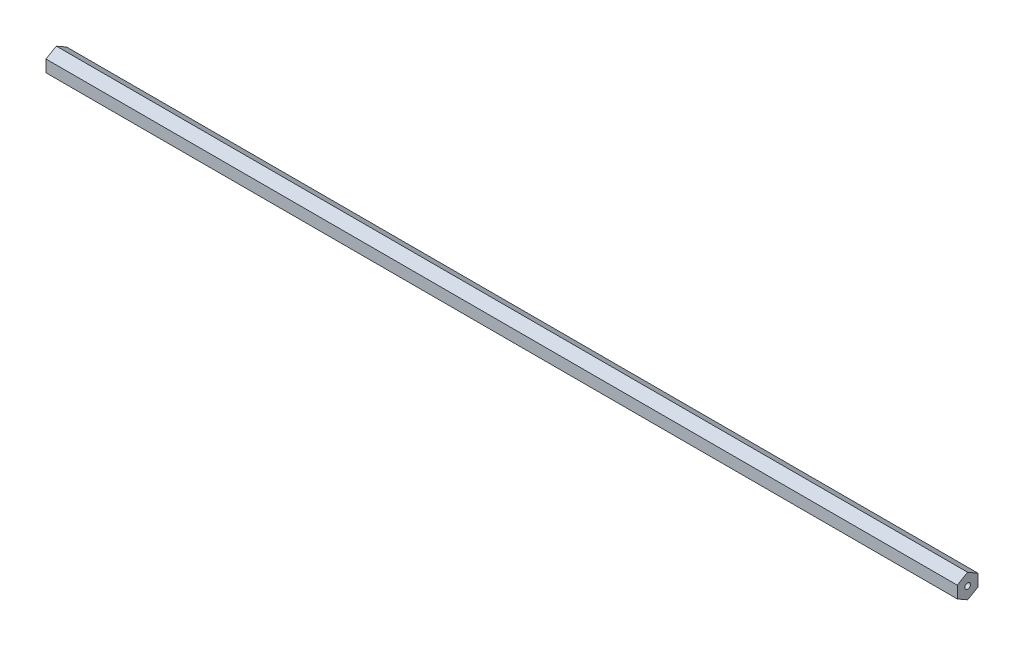
ISO-10303-21;
HEADER;
FILE_DESCRIPTION(('STEP AP214'),'2;1');
FILE_NAME('part.step','',(''),(''),'','','');
FILE_SCHEMA(('AUTOMOTIVE_DESIGN { 1 0 10303 214 1 1 1 1 }'));
ENDSEC;
DATA;
#1=APPLICATION_CONTEXT('core data for automotive mechanical design processes');
#2=APPLICATION_PROTOCOL_DEFINITION('international standard','automotive_design',2000,#1);
#3=PRODUCT_CONTEXT('',#1,'mechanical');
#4=PRODUCT('Part','Part','',(#3));
#5=PRODUCT_RELATED_PRODUCT_CATEGORY('part','',(#4));
#6=PRODUCT_DEFINITION_FORMATION('','',#4);
#7=PRODUCT_DEFINITION_CONTEXT('part definition',#1,'design');
#8=PRODUCT_DEFINITION('design','',#6,#7);
#9=PRODUCT_DEFINITION_SHAPE('','',#8);
#10=(LENGTH_UNIT() NAMED_UNIT(*) SI_UNIT(.MILLI.,.METRE.));
#11=(NAMED_UNIT(*) PLANE_ANGLE_UNIT() SI_UNIT($,.RADIAN.));
#12=(NAMED_UNIT(*) SI_UNIT($,.STERADIAN.) SOLID_ANGLE_UNIT());
#13=UNCERTAINTY_MEASURE_WITH_UNIT(LENGTH_MEASURE(1.E-05),#10,'distance_accuracy_value','');
#14=(GEOMETRIC_REPRESENTATION_CONTEXT(3) GLOBAL_UNCERTAINTY_ASSIGNED_CONTEXT((#13)) GLOBAL_UNIT_ASSIGNED_CONTEXT((#10,
#11,#12)) REPRESENTATION_CONTEXT('',''));
#15=CARTESIAN_POINT('',(0.,0.,0.));
#16=DIRECTION('',(0.,0.,1.));
#17=DIRECTION('',(1.,0.,0.));
#18=AXIS2_PLACEMENT_3D('',#15,#16,#17);
#19=CARTESIAN_POINT('',(266.699999999844,0.,0.));
#20=DIRECTION('',(1.,0.,0.));
#21=DIRECTION('',(0.,0.,-1.));
#22=AXIS2_PLACEMENT_3D('',#19,#20,#21);
#23=CONICAL_SURFACE('',#22,1.72719999983428,1.02974425849035);
#24=CARTESIAN_POINT('',(265.662193538645,-2.27373675443232E-10,0.));
#25=VERTEX_POINT('',#24);
#26=VERTEX_LOOP('',#25);
#27=FACE_BOUND('',#26,.T.);
#28=CARTESIAN_POINT('',(266.7,0.,0.));
#29=DIRECTION('',(1.,0.,0.));
#30=DIRECTION('',(0.,0.,-1.));
#31=AXIS2_PLACEMENT_3D('',#28,#29,#30);
#32=CIRCLE('',#31,1.7272);
#33=CARTESIAN_POINT('',(266.7,0.,-1.7272));
#34=VERTEX_POINT('',#33);
#35=EDGE_CURVE('E78',#34,#34,#32,.T.);
#36=ORIENTED_EDGE('',*,*,#35,.T.);
#37=EDGE_LOOP('',(#36));
#38=FACE_BOUND('',#37,.T.);
#39=ADVANCED_FACE('F16',(#27,#38),#23,.F.);
#40=CARTESIAN_POINT('',(-266.699999999844,0.,0.));
#41=DIRECTION('',(-1.,0.,0.));
#42=DIRECTION('',(0.,0.,1.));
#43=AXIS2_PLACEMENT_3D('',#40,#41,#42);
#44=CONICAL_SURFACE('',#43,1.72719999983428,1.02974425849035);
#45=CARTESIAN_POINT('',(-265.662193538645,-2.27373675443232E-10,0.));
#46=VERTEX_POINT('',#45);
#47=VERTEX_LOOP('',#46);
#48=FACE_BOUND('',#47,.T.);
#49=CARTESIAN_POINT('',(-266.7,0.,0.));
#50=DIRECTION('',(1.,0.,0.));
#51=DIRECTION('',(0.,0.,-1.));
#52=AXIS2_PLACEMENT_3D('',#49,#50,#51);
#53=CIRCLE('',#52,1.7272);
#54=CARTESIAN_POINT('',(-266.7,0.,-1.7272));
#55=VERTEX_POINT('',#54);
#56=EDGE_CURVE('E86',#55,#55,#53,.F.);
#57=ORIENTED_EDGE('',*,*,#56,.T.);
#58=EDGE_LOOP('',(#57));
#59=FACE_BOUND('',#58,.T.);
#60=ADVANCED_FACE('F75',(#48,#59),#44,.F.);
#61=CARTESIAN_POINT('',(264.97530321572,0.,0.));
#62=DIRECTION('',(1.,0.,0.));
#63=DIRECTION('',(0.,0.,-1.));
#64=AXIS2_PLACEMENT_3D('',#61,#62,#63);
#65=CYLINDRICAL_SURFACE('',#64,1.7272);
#66=ORIENTED_EDGE('',*,*,#35,.F.);
#67=EDGE_LOOP('',(#66));
#68=FACE_BOUND('',#67,.T.);
#69=CARTESIAN_POINT('',(279.4,0.,0.));
#70=DIRECTION('',(1.,0.,0.));
#71=DIRECTION('',(0.,0.,-1.));
#72=AXIS2_PLACEMENT_3D('',#69,#70,#71);
#73=CIRCLE('',#72,1.7272);
#74=CARTESIAN_POINT('',(279.4,0.,-1.7272));
#75=VERTEX_POINT('',#74);
#76=EDGE_CURVE('E19',#75,#75,#73,.F.);
#77=ORIENTED_EDGE('',*,*,#76,.F.);
#78=EDGE_LOOP('',(#77));
#79=FACE_BOUND('',#78,.T.);
#80=ADVANCED_FACE('F188',(#68,#79),#65,.F.);
#81=CARTESIAN_POINT('',(-279.4,-3.66617420935396,6.35));
#82=DIRECTION('',(0.,-0.866025403784429,0.500000000000017));
#83=DIRECTION('',(0.,-0.500000000000017,-0.866025403784429));
#84=AXIS2_PLACEMENT_3D('',#81,#82,#83);
#85=PLANE('',#84);
#86=DIRECTION('',(1.,0.,0.));
#87=VECTOR('',#86,1.);
#88=CARTESIAN_POINT('',(-279.4,-3.66617420935396,6.35));
#89=LINE('',#88,#87);
#90=CARTESIAN_POINT('',(-279.4,-3.66617420935396,6.35));
#91=VERTEX_POINT('',#90);
#92=CARTESIAN_POINT('',(279.4,-3.66617420935396,6.35));
#93=VERTEX_POINT('',#92);
#94=EDGE_CURVE('E123',#91,#93,#89,.T.);
#95=ORIENTED_EDGE('',*,*,#94,.F.);
#96=DIRECTION('',(0.,-0.499999999999983,-0.866025403784448));
#97=VECTOR('',#96,1.);
#98=CARTESIAN_POINT('',(-279.4,-3.66617420935396,6.35));
#99=LINE('',#98,#97);
#100=CARTESIAN_POINT('',(-279.4,-7.33234841870804,0.));
#101=VERTEX_POINT('',#100);
#102=EDGE_CURVE('E102',#91,#101,#99,.T.);
#103=ORIENTED_EDGE('',*,*,#102,.T.);
#104=DIRECTION('',(1.,0.,0.));
#105=VECTOR('',#104,1.);
#106=CARTESIAN_POINT('',(-279.4,-7.33234841870792,0.));
#107=LINE('',#106,#105);
#108=CARTESIAN_POINT('',(279.4,-7.33234841870804,0.));
#109=VERTEX_POINT('',#108);
#110=EDGE_CURVE('E80',#109,#101,#107,.F.);
#111=ORIENTED_EDGE('',*,*,#110,.F.);
#112=DIRECTION('',(0.,-0.499999999999983,-0.866025403784448));
#113=VECTOR('',#112,1.);
#114=CARTESIAN_POINT('',(279.4,-3.66617420935396,6.35));
#115=LINE('',#114,#113);
#116=EDGE_CURVE('E120',#93,#109,#115,.T.);
#117=ORIENTED_EDGE('',*,*,#116,.F.);
#118=EDGE_LOOP('',(#95,#103,#111,#117));
#119=FACE_BOUND('',#118,.T.);
#120=ADVANCED_FACE('F178',(#119),#85,.T.);
#121=CARTESIAN_POINT('',(-279.4,-7.33234841870792,0.));
#122=DIRECTION('',(0.,-0.866025403784429,-0.500000000000017));
#123=DIRECTION('',(0.,0.500000000000017,-0.866025403784429));
#124=AXIS2_PLACEMENT_3D('',#121,#122,#123);
#125=PLANE('',#124);
#126=ORIENTED_EDGE('',*,*,#110,.T.);
#127=DIRECTION('',(0.,0.499999999999983,-0.866025403784448));
#128=VECTOR('',#127,1.);
#129=CARTESIAN_POINT('',(-279.4,-7.33234841870792,0.));
#130=LINE('',#129,#128);
#131=CARTESIAN_POINT('',(-279.4,-3.66617420935384,-6.34999999999993));
#132=VERTEX_POINT('',#131);
#133=EDGE_CURVE('E97',#101,#132,#130,.T.);
#134=ORIENTED_EDGE('',*,*,#133,.T.);
#135=DIRECTION('',(-1.,0.,0.));
#136=VECTOR('',#135,1.);
#137=CARTESIAN_POINT('',(-279.4,-3.66617420935396,-6.35));
#138=LINE('',#137,#136);
#139=CARTESIAN_POINT('',(279.4,-3.66617420935384,-6.34999999999993));
#140=VERTEX_POINT('',#139);
#141=EDGE_CURVE('E83',#140,#132,#138,.T.);
#142=ORIENTED_EDGE('',*,*,#141,.F.);
#143=DIRECTION('',(0.,0.499999999999983,-0.866025403784448));
#144=VECTOR('',#143,1.);
#145=CARTESIAN_POINT('',(279.4,-7.33234841870792,0.));
#146=LINE('',#145,#144);
#147=EDGE_CURVE('E117',#109,#140,#146,.T.);
#148=ORIENTED_EDGE('',*,*,#147,.F.);
#149=EDGE_LOOP('',(#126,#134,#142,#148));
#150=FACE_BOUND('',#149,.T.);
#151=ADVANCED_FACE('F147',(#150),#125,.T.);
#152=CARTESIAN_POINT('',(-279.4,-3.66617420935396,-6.35));
#153=DIRECTION('',(0.,0.,-1.));
#154=DIRECTION('',(-1.,0.,0.));
#155=AXIS2_PLACEMENT_3D('',#152,#153,#154);
#156=PLANE('',#155);
#157=ORIENTED_EDGE('',*,*,#141,.T.);
#158=DIRECTION('',(0.,1.,0.));
#159=VECTOR('',#158,1.);
#160=CARTESIAN_POINT('',(-279.4,0.,-6.35));
#161=LINE('',#160,#159);
#162=CARTESIAN_POINT('',(-279.4,3.66617420935396,-6.35));
#163=VERTEX_POINT('',#162);
#164=EDGE_CURVE('E95',#132,#163,#161,.T.);
#165=ORIENTED_EDGE('',*,*,#164,.T.);
#166=DIRECTION('',(1.,0.,0.));
#167=VECTOR('',#166,1.);
#168=CARTESIAN_POINT('',(-279.4,3.66617420935396,-6.35));
#169=LINE('',#168,#167);
#170=CARTESIAN_POINT('',(279.4,3.66617420935396,-6.35));
#171=VERTEX_POINT('',#170);
#172=EDGE_CURVE('E107',#171,#163,#169,.F.);
#173=ORIENTED_EDGE('',*,*,#172,.F.);
#174=DIRECTION('',(0.,1.,0.));
#175=VECTOR('',#174,1.);
#176=CARTESIAN_POINT('',(279.4,0.,-6.35));
#177=LINE('',#176,#175);
#178=EDGE_CURVE('E115',#140,#171,#177,.T.);
#179=ORIENTED_EDGE('',*,*,#178,.F.);
#180=EDGE_LOOP('',(#157,#165,#173,#179));
#181=FACE_BOUND('',#180,.T.);
#182=ADVANCED_FACE('F137',(#181),#156,.T.);
#183=CARTESIAN_POINT('',(-264.97530321572,0.,0.));
#184=DIRECTION('',(1.,0.,0.));
#185=DIRECTION('',(0.,0.,-1.));
#186=AXIS2_PLACEMENT_3D('',#183,#184,#185);
#187=CYLINDRICAL_SURFACE('',#186,1.7272);
#188=ORIENTED_EDGE('',*,*,#56,.F.);
#189=EDGE_LOOP('',(#188));
#190=FACE_BOUND('',#189,.T.);
#191=CARTESIAN_POINT('',(-279.4,0.,0.));
#192=DIRECTION('',(1.,0.,0.));
#193=DIRECTION('',(0.,0.,-1.));
#194=AXIS2_PLACEMENT_3D('',#191,#192,#193);
#195=CIRCLE('',#194,1.7272);
#196=CARTESIAN_POINT('',(-279.4,0.,-1.7272));
#197=VERTEX_POINT('',#196);
#198=EDGE_CURVE('E87',#197,#197,#195,.F.);
#199=ORIENTED_EDGE('',*,*,#198,.T.);
#200=EDGE_LOOP('',(#199));
#201=FACE_BOUND('',#200,.T.);
#202=ADVANCED_FACE('F134',(#190,#201),#187,.F.);
#203=CARTESIAN_POINT('',(-279.4,3.66617420935396,6.35));
#204=DIRECTION('',(0.,0.,1.));
#205=DIRECTION('',(1.,0.,0.));
#206=AXIS2_PLACEMENT_3D('',#203,#204,#205);
#207=PLANE('',#206);
#208=DIRECTION('',(1.,0.,0.));
#209=VECTOR('',#208,1.);
#210=CARTESIAN_POINT('',(-279.4,3.66617420935371,6.34999999999986));
#211=LINE('',#210,#209);
#212=CARTESIAN_POINT('',(-279.4,3.6661742093539,6.34999999999997));
#213=VERTEX_POINT('',#212);
#214=CARTESIAN_POINT('',(279.4,3.6661742093539,6.34999999999997));
#215=VERTEX_POINT('',#214);
#216=EDGE_CURVE('E89',#213,#215,#211,.T.);
#217=ORIENTED_EDGE('',*,*,#216,.F.);
#218=DIRECTION('',(0.,1.,0.));
#219=VECTOR('',#218,1.);
#220=CARTESIAN_POINT('',(-279.4,0.,6.35));
#221=LINE('',#220,#219);
#222=EDGE_CURVE('E104',#213,#91,#221,.F.);
#223=ORIENTED_EDGE('',*,*,#222,.T.);
#224=ORIENTED_EDGE('',*,*,#94,.T.);
#225=DIRECTION('',(0.,1.,0.));
#226=VECTOR('',#225,1.);
#227=CARTESIAN_POINT('',(279.4,0.,6.35));
#228=LINE('',#227,#226);
#229=EDGE_CURVE('E112',#215,#93,#228,.F.);
#230=ORIENTED_EDGE('',*,*,#229,.F.);
#231=EDGE_LOOP('',(#217,#223,#224,#230));
#232=FACE_BOUND('',#231,.T.);
#233=ADVANCED_FACE('F136',(#232),#207,.T.);
#234=CARTESIAN_POINT('',(279.4,0.,0.));
#235=DIRECTION('',(1.,0.,0.));
#236=DIRECTION('',(0.,0.,-1.));
#237=AXIS2_PLACEMENT_3D('',#234,#235,#236);
#238=PLANE('',#237);
#239=ORIENTED_EDGE('',*,*,#76,.T.);
#240=EDGE_LOOP('',(#239));
#241=FACE_BOUND('',#240,.T.);
#242=DIRECTION('',(0.,-0.500000000000017,0.866025403784429));
#243=VECTOR('',#242,1.);
#244=CARTESIAN_POINT('',(279.4,7.33234841870792,0.));
#245=LINE('',#244,#243);
#246=CARTESIAN_POINT('',(279.4,7.33234841870798,0.));
#247=VERTEX_POINT('',#246);
#248=EDGE_CURVE('E93',#215,#247,#245,.F.);
#249=ORIENTED_EDGE('',*,*,#248,.F.);
#250=ORIENTED_EDGE('',*,*,#229,.T.);
#251=ORIENTED_EDGE('',*,*,#116,.T.);
#252=ORIENTED_EDGE('',*,*,#147,.T.);
#253=ORIENTED_EDGE('',*,*,#178,.T.);
#254=DIRECTION('',(0.,0.500000000000017,0.866025403784429));
#255=VECTOR('',#254,1.);
#256=CARTESIAN_POINT('',(279.4,3.66617420935396,-6.35));
#257=LINE('',#256,#255);
#258=EDGE_CURVE('E109',#247,#171,#257,.F.);
#259=ORIENTED_EDGE('',*,*,#258,.F.);
#260=EDGE_LOOP('',(#249,#250,#251,#252,#253,#259));
#261=FACE_BOUND('',#260,.T.);
#262=ADVANCED_FACE('F144',(#241,#261),#238,.T.);
#263=CARTESIAN_POINT('',(-279.4,3.66617420935396,-6.35));
#264=DIRECTION('',(0.,0.866025403784429,-0.500000000000017));
#265=DIRECTION('',(0.,0.500000000000017,0.866025403784429));
#266=AXIS2_PLACEMENT_3D('',#263,#264,#265);
#267=PLANE('',#266);
#268=ORIENTED_EDGE('',*,*,#172,.T.);
#269=DIRECTION('',(0.,0.499999999999983,0.866025403784448));
#270=VECTOR('',#269,1.);
#271=CARTESIAN_POINT('',(-279.4,3.66617420935396,-6.35));
#272=LINE('',#271,#270);
#273=CARTESIAN_POINT('',(-279.4,7.33234841870804,0.));
#274=VERTEX_POINT('',#273);
#275=EDGE_CURVE('E34',#163,#274,#272,.T.);
#276=ORIENTED_EDGE('',*,*,#275,.T.);
#277=DIRECTION('',(1.,0.,0.));
#278=VECTOR('',#277,1.);
#279=CARTESIAN_POINT('',(-279.4,7.33234841870792,0.));
#280=LINE('',#279,#278);
#281=EDGE_CURVE('E25',#247,#274,#280,.F.);
#282=ORIENTED_EDGE('',*,*,#281,.F.);
#283=ORIENTED_EDGE('',*,*,#258,.T.);
#284=EDGE_LOOP('',(#268,#276,#282,#283));
#285=FACE_BOUND('',#284,.T.);
#286=ADVANCED_FACE('F157',(#285),#267,.T.);
#287=CARTESIAN_POINT('',(-279.4,0.,0.));
#288=DIRECTION('',(1.,0.,0.));
#289=DIRECTION('',(0.,0.,-1.));
#290=AXIS2_PLACEMENT_3D('',#287,#288,#289);
#291=PLANE('',#290);
#292=ORIENTED_EDGE('',*,*,#198,.F.);
#293=EDGE_LOOP('',(#292));
#294=FACE_BOUND('',#293,.T.);
#295=ORIENTED_EDGE('',*,*,#275,.F.);
#296=ORIENTED_EDGE('',*,*,#164,.F.);
#297=ORIENTED_EDGE('',*,*,#133,.F.);
#298=ORIENTED_EDGE('',*,*,#102,.F.);
#299=ORIENTED_EDGE('',*,*,#222,.F.);
#300=DIRECTION('',(0.,-0.500000000000017,0.866025403784429));
#301=VECTOR('',#300,1.);
#302=CARTESIAN_POINT('',(-279.4,7.33234841870792,0.));
#303=LINE('',#302,#301);
#304=EDGE_CURVE('E11',#274,#213,#303,.T.);
#305=ORIENTED_EDGE('',*,*,#304,.F.);
#306=EDGE_LOOP('',(#295,#296,#297,#298,#299,#305));
#307=FACE_BOUND('',#306,.T.);
#308=ADVANCED_FACE('F151',(#294,#307),#291,.F.);
#309=CARTESIAN_POINT('',(-279.4,7.33234841870792,0.));
#310=DIRECTION('',(0.,0.866025403784429,0.500000000000017));
#311=DIRECTION('',(0.,-0.500000000000017,0.866025403784429));
#312=AXIS2_PLACEMENT_3D('',#309,#310,#311);
#313=PLANE('',#312);
#314=ORIENTED_EDGE('',*,*,#281,.T.);
#315=ORIENTED_EDGE('',*,*,#304,.T.);
#316=ORIENTED_EDGE('',*,*,#216,.T.);
#317=ORIENTED_EDGE('',*,*,#248,.T.);
#318=EDGE_LOOP('',(#314,#315,#316,#317));
#319=FACE_BOUND('',#318,.T.);
#320=ADVANCED_FACE('F149',(#319),#313,.T.);
#321=CLOSED_SHELL('',(#39,#60,#80,#120,#151,#182,#202,#233,#262,#286,#308,#320));
#322=MANIFOLD_SOLID_BREP('B1',#321);
#323=ADVANCED_BREP_SHAPE_REPRESENTATION('',(#18,#322),#14);
#324=SHAPE_DEFINITION_REPRESENTATION(#9,#323);
ENDSEC;
END-ISO-10303-21;
